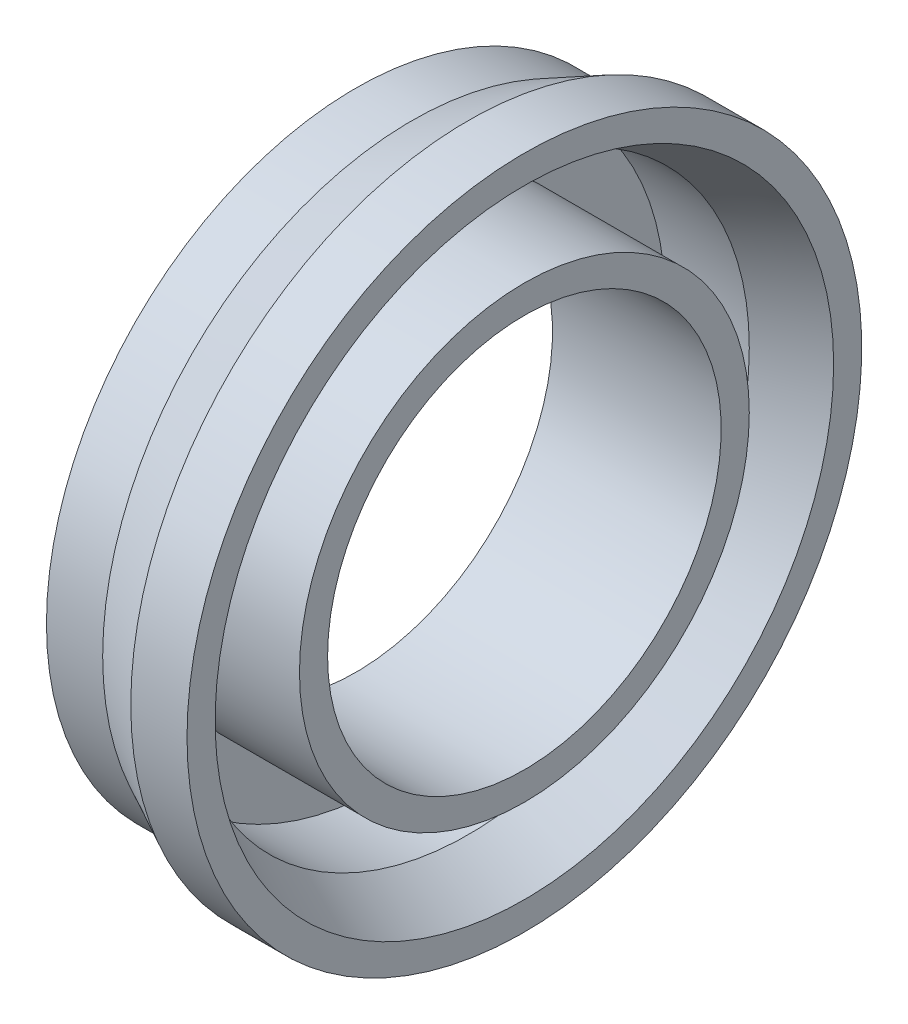
ISO-10303-21;
HEADER;
FILE_DESCRIPTION(('STEP AP214'),'2;1');
FILE_NAME('part.step','',(''),(''),'','','');
FILE_SCHEMA(('AUTOMOTIVE_DESIGN { 1 0 10303 214 1 1 1 1 }'));
ENDSEC;
DATA;
#1=APPLICATION_CONTEXT('core data for automotive mechanical design processes');
#2=APPLICATION_PROTOCOL_DEFINITION('international standard','automotive_design',2000,#1);
#3=PRODUCT_CONTEXT('',#1,'mechanical');
#4=PRODUCT('Part','Part','',(#3));
#5=PRODUCT_RELATED_PRODUCT_CATEGORY('part','',(#4));
#6=PRODUCT_DEFINITION_FORMATION('','',#4);
#7=PRODUCT_DEFINITION_CONTEXT('part definition',#1,'design');
#8=PRODUCT_DEFINITION('design','',#6,#7);
#9=PRODUCT_DEFINITION_SHAPE('','',#8);
#10=(LENGTH_UNIT() NAMED_UNIT(*) SI_UNIT(.MILLI.,.METRE.));
#11=(NAMED_UNIT(*) PLANE_ANGLE_UNIT() SI_UNIT($,.RADIAN.));
#12=(NAMED_UNIT(*) SI_UNIT($,.STERADIAN.) SOLID_ANGLE_UNIT());
#13=UNCERTAINTY_MEASURE_WITH_UNIT(LENGTH_MEASURE(1.E-05),#10,'distance_accuracy_value','');
#14=(GEOMETRIC_REPRESENTATION_CONTEXT(3) GLOBAL_UNCERTAINTY_ASSIGNED_CONTEXT((#13)) GLOBAL_UNIT_ASSIGNED_CONTEXT((#10,
#11,#12)) REPRESENTATION_CONTEXT('',''));
#15=CARTESIAN_POINT('',(0.,0.,0.));
#16=DIRECTION('',(0.,0.,1.));
#17=DIRECTION('',(1.,0.,0.));
#18=AXIS2_PLACEMENT_3D('',#15,#16,#17);
#19=CARTESIAN_POINT('',(2.,0.,0.));
#20=DIRECTION('',(1.,0.,0.));
#21=DIRECTION('',(0.,0.,-1.));
#22=AXIS2_PLACEMENT_3D('',#19,#20,#21);
#23=CONICAL_SURFACE('',#22,5.,0.463647609000806);
#24=CARTESIAN_POINT('',(2.99999999999989,0.,0.));
#25=DIRECTION('',(1.,0.,0.));
#26=DIRECTION('',(0.,0.,-1.));
#27=AXIS2_PLACEMENT_3D('',#24,#25,#26);
#28=CIRCLE('',#27,5.49999999999994);
#29=CARTESIAN_POINT('',(2.99999999999989,0.,-5.49999999999994));
#30=VERTEX_POINT('',#29);
#31=EDGE_CURVE('E17',#30,#30,#28,.F.);
#32=ORIENTED_EDGE('',*,*,#31,.F.);
#33=EDGE_LOOP('',(#32));
#34=FACE_BOUND('',#33,.T.);
#35=CARTESIAN_POINT('',(2.,0.,0.));
#36=DIRECTION('',(-1.,0.,0.));
#37=DIRECTION('',(0.,0.,1.));
#38=AXIS2_PLACEMENT_3D('',#35,#36,#37);
#39=CIRCLE('',#38,5.);
#40=CARTESIAN_POINT('',(2.,0.,5.));
#41=VERTEX_POINT('',#40);
#42=EDGE_CURVE('E29',#41,#41,#39,.F.);
#43=ORIENTED_EDGE('',*,*,#42,.F.);
#44=EDGE_LOOP('',(#43));
#45=FACE_BOUND('',#44,.T.);
#46=ADVANCED_FACE('F14',(#34,#45),#23,.F.);
#47=CARTESIAN_POINT('',(3.,6.,0.));
#48=DIRECTION('',(-1.,0.,0.));
#49=DIRECTION('',(0.,0.,1.));
#50=AXIS2_PLACEMENT_3D('',#47,#48,#49);
#51=PLANE('',#50);
#52=ORIENTED_EDGE('',*,*,#31,.T.);
#53=EDGE_LOOP('',(#52));
#54=FACE_BOUND('',#53,.T.);
#55=CARTESIAN_POINT('',(3.,0.,0.));
#56=DIRECTION('',(-1.,0.,0.));
#57=DIRECTION('',(0.,0.,1.));
#58=AXIS2_PLACEMENT_3D('',#55,#56,#57);
#59=CIRCLE('',#58,6.);
#60=CARTESIAN_POINT('',(3.,0.,6.));
#61=VERTEX_POINT('',#60);
#62=EDGE_CURVE('E44',#61,#61,#59,.T.);
#63=ORIENTED_EDGE('',*,*,#62,.F.);
#64=EDGE_LOOP('',(#63));
#65=FACE_BOUND('',#64,.T.);
#66=ADVANCED_FACE('F54',(#54,#65),#51,.F.);
#67=CARTESIAN_POINT('',(2.,0.,0.));
#68=DIRECTION('',(-1.,0.,0.));
#69=DIRECTION('',(0.,0.,1.));
#70=AXIS2_PLACEMENT_3D('',#67,#68,#69);
#71=CYLINDRICAL_SURFACE('',#70,5.);
#72=CARTESIAN_POINT('',(0.5,0.,0.));
#73=DIRECTION('',(-1.,0.,0.));
#74=DIRECTION('',(0.,0.,1.));
#75=AXIS2_PLACEMENT_3D('',#72,#73,#74);
#76=CIRCLE('',#75,5.);
#77=CARTESIAN_POINT('',(0.5,0.,5.));
#78=VERTEX_POINT('',#77);
#79=EDGE_CURVE('E42',#78,#78,#76,.F.);
#80=ORIENTED_EDGE('',*,*,#79,.F.);
#81=EDGE_LOOP('',(#80));
#82=FACE_BOUND('',#81,.T.);
#83=ORIENTED_EDGE('',*,*,#42,.T.);
#84=EDGE_LOOP('',(#83));
#85=FACE_BOUND('',#84,.T.);
#86=ADVANCED_FACE('F63',(#82,#85),#71,.F.);
#87=CARTESIAN_POINT('',(2.,0.,0.));
#88=DIRECTION('',(-1.,0.,0.));
#89=DIRECTION('',(0.,0.,1.));
#90=AXIS2_PLACEMENT_3D('',#87,#88,#89);
#91=CYLINDRICAL_SURFACE('',#90,6.);
#92=ORIENTED_EDGE('',*,*,#62,.T.);
#93=EDGE_LOOP('',(#92));
#94=FACE_BOUND('',#93,.T.);
#95=CARTESIAN_POINT('',(2.,0.,0.));
#96=DIRECTION('',(1.,0.,0.));
#97=DIRECTION('',(0.,0.,-1.));
#98=AXIS2_PLACEMENT_3D('',#95,#96,#97);
#99=CIRCLE('',#98,6.);
#100=CARTESIAN_POINT('',(2.,0.,-6.));
#101=VERTEX_POINT('',#100);
#102=EDGE_CURVE('E41',#101,#101,#99,.F.);
#103=ORIENTED_EDGE('',*,*,#102,.F.);
#104=EDGE_LOOP('',(#103));
#105=FACE_BOUND('',#104,.T.);
#106=ADVANCED_FACE('F94',(#94,#105),#91,.T.);
#107=CARTESIAN_POINT('',(0.5,4.,0.));
#108=DIRECTION('',(-1.,0.,0.));
#109=DIRECTION('',(0.,0.,1.));
#110=AXIS2_PLACEMENT_3D('',#107,#108,#109);
#111=PLANE('',#110);
#112=CARTESIAN_POINT('',(0.5,0.,0.));
#113=DIRECTION('',(-1.,0.,0.));
#114=DIRECTION('',(0.,0.,1.));
#115=AXIS2_PLACEMENT_3D('',#112,#113,#114);
#116=CIRCLE('',#115,4.);
#117=CARTESIAN_POINT('',(0.5,0.,4.));
#118=VERTEX_POINT('',#117);
#119=EDGE_CURVE('E38',#118,#118,#116,.F.);
#120=ORIENTED_EDGE('',*,*,#119,.F.);
#121=EDGE_LOOP('',(#120));
#122=FACE_BOUND('',#121,.T.);
#123=ORIENTED_EDGE('',*,*,#79,.T.);
#124=EDGE_LOOP('',(#123));
#125=FACE_BOUND('',#124,.T.);
#126=ADVANCED_FACE('F90',(#122,#125),#111,.F.);
#127=CARTESIAN_POINT('',(2.,0.,0.));
#128=DIRECTION('',(1.,0.,0.));
#129=DIRECTION('',(0.,0.,-1.));
#130=AXIS2_PLACEMENT_3D('',#127,#128,#129);
#131=CONICAL_SURFACE('',#130,6.,0.463647609000806);
#132=CARTESIAN_POINT('',(1.,0.,0.));
#133=DIRECTION('',(-1.,0.,0.));
#134=DIRECTION('',(0.,0.,1.));
#135=AXIS2_PLACEMENT_3D('',#132,#133,#134);
#136=CIRCLE('',#135,5.5);
#137=CARTESIAN_POINT('',(1.,0.,5.5));
#138=VERTEX_POINT('',#137);
#139=EDGE_CURVE('E37',#138,#138,#136,.T.);
#140=ORIENTED_EDGE('',*,*,#139,.F.);
#141=EDGE_LOOP('',(#140));
#142=FACE_BOUND('',#141,.T.);
#143=ORIENTED_EDGE('',*,*,#102,.T.);
#144=EDGE_LOOP('',(#143));
#145=FACE_BOUND('',#144,.T.);
#146=ADVANCED_FACE('F86',(#142,#145),#131,.T.);
#147=CARTESIAN_POINT('',(0.5,0.,0.));
#148=DIRECTION('',(-1.,0.,0.));
#149=DIRECTION('',(0.,0.,1.));
#150=AXIS2_PLACEMENT_3D('',#147,#148,#149);
#151=CYLINDRICAL_SURFACE('',#150,4.);
#152=CARTESIAN_POINT('',(3.,0.,0.));
#153=DIRECTION('',(-1.,0.,0.));
#154=DIRECTION('',(0.,0.,1.));
#155=AXIS2_PLACEMENT_3D('',#152,#153,#154);
#156=CIRCLE('',#155,4.);
#157=CARTESIAN_POINT('',(3.,0.,4.));
#158=VERTEX_POINT('',#157);
#159=EDGE_CURVE('E34',#158,#158,#156,.F.);
#160=ORIENTED_EDGE('',*,*,#159,.F.);
#161=EDGE_LOOP('',(#160));
#162=FACE_BOUND('',#161,.T.);
#163=ORIENTED_EDGE('',*,*,#119,.T.);
#164=EDGE_LOOP('',(#163));
#165=FACE_BOUND('',#164,.T.);
#166=ADVANCED_FACE('F82',(#162,#165),#151,.T.);
#167=CARTESIAN_POINT('',(0.,0.,0.));
#168=DIRECTION('',(-1.,0.,0.));
#169=DIRECTION('',(0.,0.,1.));
#170=AXIS2_PLACEMENT_3D('',#167,#168,#169);
#171=CYLINDRICAL_SURFACE('',#170,5.5);
#172=ORIENTED_EDGE('',*,*,#139,.T.);
#173=EDGE_LOOP('',(#172));
#174=FACE_BOUND('',#173,.T.);
#175=CARTESIAN_POINT('',(0.,0.,0.));
#176=DIRECTION('',(-1.,0.,0.));
#177=DIRECTION('',(0.,0.,1.));
#178=AXIS2_PLACEMENT_3D('',#175,#176,#177);
#179=CIRCLE('',#178,5.5);
#180=CARTESIAN_POINT('',(0.,0.,5.5));
#181=VERTEX_POINT('',#180);
#182=EDGE_CURVE('E26',#181,#181,#179,.T.);
#183=ORIENTED_EDGE('',*,*,#182,.F.);
#184=EDGE_LOOP('',(#183));
#185=FACE_BOUND('',#184,.T.);
#186=ADVANCED_FACE('F78',(#174,#185),#171,.T.);
#187=CARTESIAN_POINT('',(3.,4.,0.));
#188=DIRECTION('',(-1.,0.,0.));
#189=DIRECTION('',(0.,0.,1.));
#190=AXIS2_PLACEMENT_3D('',#187,#188,#189);
#191=PLANE('',#190);
#192=CARTESIAN_POINT('',(3.,0.,0.));
#193=DIRECTION('',(-1.,0.,0.));
#194=DIRECTION('',(0.,0.,1.));
#195=AXIS2_PLACEMENT_3D('',#192,#193,#194);
#196=CIRCLE('',#195,3.5);
#197=CARTESIAN_POINT('',(3.,0.,3.5));
#198=VERTEX_POINT('',#197);
#199=EDGE_CURVE('E21',#198,#198,#196,.F.);
#200=ORIENTED_EDGE('',*,*,#199,.F.);
#201=EDGE_LOOP('',(#200));
#202=FACE_BOUND('',#201,.T.);
#203=ORIENTED_EDGE('',*,*,#159,.T.);
#204=EDGE_LOOP('',(#203));
#205=FACE_BOUND('',#204,.T.);
#206=ADVANCED_FACE('F71',(#202,#205),#191,.F.);
#207=CARTESIAN_POINT('',(0.,3.5,0.));
#208=DIRECTION('',(1.,0.,0.));
#209=DIRECTION('',(0.,0.,-1.));
#210=AXIS2_PLACEMENT_3D('',#207,#208,#209);
#211=PLANE('',#210);
#212=CARTESIAN_POINT('',(0.,0.,0.));
#213=DIRECTION('',(-1.,0.,0.));
#214=DIRECTION('',(0.,0.,1.));
#215=AXIS2_PLACEMENT_3D('',#212,#213,#214);
#216=CIRCLE('',#215,3.5);
#217=CARTESIAN_POINT('',(0.,0.,3.5));
#218=VERTEX_POINT('',#217);
#219=EDGE_CURVE('E10',#218,#218,#216,.T.);
#220=ORIENTED_EDGE('',*,*,#219,.F.);
#221=EDGE_LOOP('',(#220));
#222=FACE_BOUND('',#221,.T.);
#223=ORIENTED_EDGE('',*,*,#182,.T.);
#224=EDGE_LOOP('',(#223));
#225=FACE_BOUND('',#224,.T.);
#226=ADVANCED_FACE('F66',(#222,#225),#211,.F.);
#227=CARTESIAN_POINT('',(3.,0.,0.));
#228=DIRECTION('',(-1.,0.,0.));
#229=DIRECTION('',(0.,0.,1.));
#230=AXIS2_PLACEMENT_3D('',#227,#228,#229);
#231=CYLINDRICAL_SURFACE('',#230,3.5);
#232=ORIENTED_EDGE('',*,*,#219,.T.);
#233=EDGE_LOOP('',(#232));
#234=FACE_BOUND('',#233,.T.);
#235=ORIENTED_EDGE('',*,*,#199,.T.);
#236=EDGE_LOOP('',(#235));
#237=FACE_BOUND('',#236,.T.);
#238=ADVANCED_FACE('F64',(#234,#237),#231,.F.);
#239=CLOSED_SHELL('',(#46,#66,#86,#106,#126,#146,#166,#186,#206,#226,#238));
#240=MANIFOLD_SOLID_BREP('B1',#239);
#241=ADVANCED_BREP_SHAPE_REPRESENTATION('',(#18,#240),#14);
#242=SHAPE_DEFINITION_REPRESENTATION(#9,#241);
ENDSEC;
END-ISO-10303-21;
